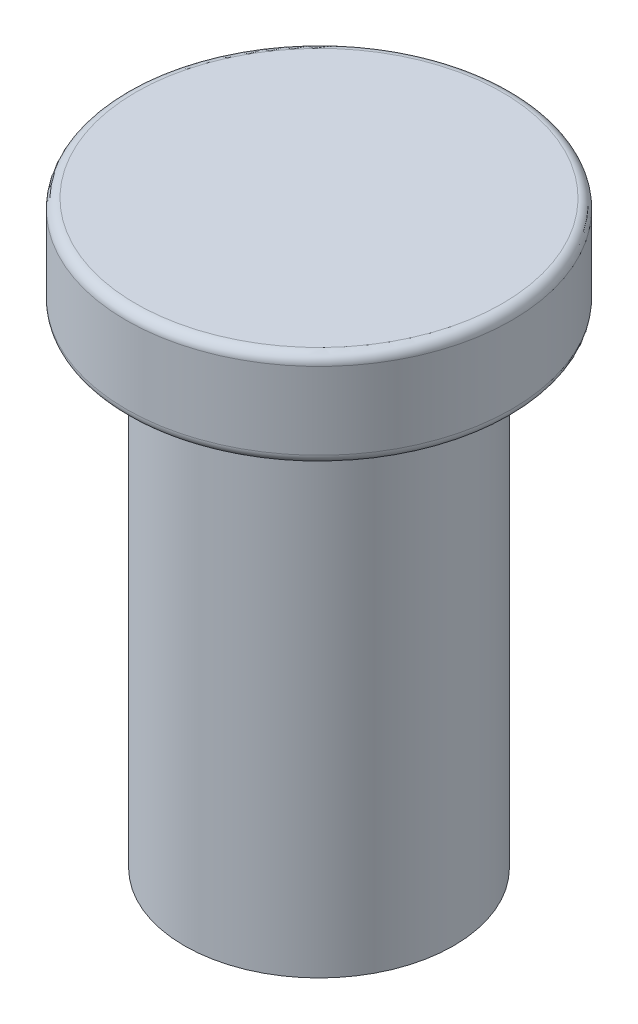
ISO-10303-21;
HEADER;
FILE_DESCRIPTION(('STEP AP214'),'2;1');
FILE_NAME('part.step','',(''),(''),'','','');
FILE_SCHEMA(('AUTOMOTIVE_DESIGN { 1 0 10303 214 1 1 1 1 }'));
ENDSEC;
DATA;
#1=APPLICATION_CONTEXT('core data for automotive mechanical design processes');
#2=APPLICATION_PROTOCOL_DEFINITION('international standard','automotive_design',2000,#1);
#3=PRODUCT_CONTEXT('',#1,'mechanical');
#4=PRODUCT('Part','Part','',(#3));
#5=PRODUCT_RELATED_PRODUCT_CATEGORY('part','',(#4));
#6=PRODUCT_DEFINITION_FORMATION('','',#4);
#7=PRODUCT_DEFINITION_CONTEXT('part definition',#1,'design');
#8=PRODUCT_DEFINITION('design','',#6,#7);
#9=PRODUCT_DEFINITION_SHAPE('','',#8);
#10=(LENGTH_UNIT() NAMED_UNIT(*) SI_UNIT(.MILLI.,.METRE.));
#11=(NAMED_UNIT(*) PLANE_ANGLE_UNIT() SI_UNIT($,.RADIAN.));
#12=(NAMED_UNIT(*) SI_UNIT($,.STERADIAN.) SOLID_ANGLE_UNIT());
#13=UNCERTAINTY_MEASURE_WITH_UNIT(LENGTH_MEASURE(1.E-05),#10,'distance_accuracy_value','');
#14=(GEOMETRIC_REPRESENTATION_CONTEXT(3) GLOBAL_UNCERTAINTY_ASSIGNED_CONTEXT((#13)) GLOBAL_UNIT_ASSIGNED_CONTEXT((#10,
#11,#12)) REPRESENTATION_CONTEXT('',''));
#15=CARTESIAN_POINT('',(0.,0.,0.));
#16=DIRECTION('',(0.,0.,1.));
#17=DIRECTION('',(1.,0.,0.));
#18=AXIS2_PLACEMENT_3D('',#15,#16,#17);
#19=CARTESIAN_POINT('',(-2.37,11.22,0.));
#20=DIRECTION('',(0.,1.,0.));
#21=DIRECTION('',(-1.,0.,0.));
#22=AXIS2_PLACEMENT_3D('',#19,#20,#21);
#23=PLANE('',#22);
#24=CARTESIAN_POINT('',(0.,11.22,0.));
#25=DIRECTION('',(0.,-1.,0.));
#26=DIRECTION('',(1.,0.,0.));
#27=AXIS2_PLACEMENT_3D('',#24,#25,#26);
#28=CIRCLE('',#27,2.37);
#29=CARTESIAN_POINT('',(2.37,11.22,0.));
#30=VERTEX_POINT('',#29);
#31=EDGE_CURVE('E10',#30,#30,#28,.T.);
#32=ORIENTED_EDGE('',*,*,#31,.T.);
#33=EDGE_LOOP('',(#32));
#34=FACE_BOUND('',#33,.T.);
#35=ADVANCED_FACE('F34',(#34),#23,.F.);
#36=CARTESIAN_POINT('',(0.,11.02,0.));
#37=DIRECTION('',(0.,-1.,0.));
#38=DIRECTION('',(1.,0.,0.));
#39=AXIS2_PLACEMENT_3D('',#36,#37,#38);
#40=TOROIDAL_SURFACE('',#39,2.37,0.2);
#41=ORIENTED_EDGE('',*,*,#31,.F.);
#42=EDGE_LOOP('',(#41));
#43=FACE_BOUND('',#42,.T.);
#44=CARTESIAN_POINT('',(0.,11.02,0.));
#45=DIRECTION('',(0.,-1.,0.));
#46=DIRECTION('',(1.,0.,0.));
#47=AXIS2_PLACEMENT_3D('',#44,#45,#46);
#48=CIRCLE('',#47,2.57);
#49=CARTESIAN_POINT('',(2.57,11.02,0.));
#50=VERTEX_POINT('',#49);
#51=EDGE_CURVE('E41',#50,#50,#48,.T.);
#52=ORIENTED_EDGE('',*,*,#51,.T.);
#53=EDGE_LOOP('',(#52));
#54=FACE_BOUND('',#53,.T.);
#55=ADVANCED_FACE('F93',(#43,#54),#40,.F.);
#56=CARTESIAN_POINT('',(0.,0.,0.));
#57=DIRECTION('',(0.,-1.,0.));
#58=DIRECTION('',(1.,0.,0.));
#59=AXIS2_PLACEMENT_3D('',#56,#57,#58);
#60=CYLINDRICAL_SURFACE('',#59,2.57);
#61=ORIENTED_EDGE('',*,*,#51,.F.);
#62=EDGE_LOOP('',(#61));
#63=FACE_BOUND('',#62,.T.);
#64=CARTESIAN_POINT('',(0.,0.,0.));
#65=DIRECTION('',(0.,-1.,0.));
#66=DIRECTION('',(1.,0.,0.));
#67=AXIS2_PLACEMENT_3D('',#64,#65,#66);
#68=CIRCLE('',#67,2.57);
#69=CARTESIAN_POINT('',(2.57,0.,0.));
#70=VERTEX_POINT('',#69);
#71=EDGE_CURVE('E47',#70,#70,#68,.T.);
#72=ORIENTED_EDGE('',*,*,#71,.T.);
#73=EDGE_LOOP('',(#72));
#74=FACE_BOUND('',#73,.T.);
#75=ADVANCED_FACE('F97',(#63,#74),#60,.F.);
#76=CARTESIAN_POINT('',(-2.79999999999999,0.,0.));
#77=DIRECTION('',(0.,1.,0.));
#78=DIRECTION('',(-1.,0.,0.));
#79=AXIS2_PLACEMENT_3D('',#76,#77,#78);
#80=PLANE('',#79);
#81=ORIENTED_EDGE('',*,*,#71,.F.);
#82=EDGE_LOOP('',(#81));
#83=FACE_BOUND('',#82,.T.);
#84=CARTESIAN_POINT('',(0.,0.,0.));
#85=DIRECTION('',(0.,-1.,0.));
#86=DIRECTION('',(1.,0.,0.));
#87=AXIS2_PLACEMENT_3D('',#84,#85,#86);
#88=CIRCLE('',#87,2.79999999999999);
#89=CARTESIAN_POINT('',(2.79999999999999,0.,0.));
#90=VERTEX_POINT('',#89);
#91=EDGE_CURVE('E53',#90,#90,#88,.T.);
#92=ORIENTED_EDGE('',*,*,#91,.T.);
#93=EDGE_LOOP('',(#92));
#94=FACE_BOUND('',#93,.T.);
#95=ADVANCED_FACE('F102',(#83,#94),#80,.F.);
#96=CARTESIAN_POINT('',(0.,0.,0.));
#97=DIRECTION('',(0.,-1.,0.));
#98=DIRECTION('',(1.,0.,0.));
#99=AXIS2_PLACEMENT_3D('',#96,#97,#98);
#100=CYLINDRICAL_SURFACE('',#99,2.8);
#101=ORIENTED_EDGE('',*,*,#91,.F.);
#102=EDGE_LOOP('',(#101));
#103=FACE_BOUND('',#102,.T.);
#104=CARTESIAN_POINT('',(0.,10.07,0.));
#105=DIRECTION('',(0.,-1.,0.));
#106=DIRECTION('',(1.,0.,0.));
#107=AXIS2_PLACEMENT_3D('',#104,#105,#106);
#108=CIRCLE('',#107,2.8);
#109=CARTESIAN_POINT('',(2.8,10.07,0.));
#110=VERTEX_POINT('',#109);
#111=EDGE_CURVE('E59',#110,#110,#108,.T.);
#112=ORIENTED_EDGE('',*,*,#111,.T.);
#113=EDGE_LOOP('',(#112));
#114=FACE_BOUND('',#113,.T.);
#115=ADVANCED_FACE('F108',(#103,#114),#100,.T.);
#116=CARTESIAN_POINT('',(-3.81,10.07,0.));
#117=DIRECTION('',(0.,1.,0.));
#118=DIRECTION('',(-1.,0.,0.));
#119=AXIS2_PLACEMENT_3D('',#116,#117,#118);
#120=PLANE('',#119);
#121=ORIENTED_EDGE('',*,*,#111,.F.);
#122=EDGE_LOOP('',(#121));
#123=FACE_BOUND('',#122,.T.);
#124=CARTESIAN_POINT('',(0.,10.07,0.));
#125=DIRECTION('',(0.,-1.,0.));
#126=DIRECTION('',(1.,0.,0.));
#127=AXIS2_PLACEMENT_3D('',#124,#125,#126);
#128=CIRCLE('',#127,3.81);
#129=CARTESIAN_POINT('',(3.81,10.07,0.));
#130=VERTEX_POINT('',#129);
#131=EDGE_CURVE('E63',#130,#130,#128,.T.);
#132=ORIENTED_EDGE('',*,*,#131,.T.);
#133=EDGE_LOOP('',(#132));
#134=FACE_BOUND('',#133,.T.);
#135=ADVANCED_FACE('F112',(#123,#134),#120,.F.);
#136=CARTESIAN_POINT('',(0.,10.27,0.));
#137=DIRECTION('',(0.,-1.,0.));
#138=DIRECTION('',(1.,0.,0.));
#139=AXIS2_PLACEMENT_3D('',#136,#137,#138);
#140=TOROIDAL_SURFACE('',#139,3.81,0.2);
#141=ORIENTED_EDGE('',*,*,#131,.F.);
#142=EDGE_LOOP('',(#141));
#143=FACE_BOUND('',#142,.T.);
#144=CARTESIAN_POINT('',(0.,10.27,0.));
#145=DIRECTION('',(0.,-1.,0.));
#146=DIRECTION('',(1.,0.,0.));
#147=AXIS2_PLACEMENT_3D('',#144,#145,#146);
#148=CIRCLE('',#147,4.01);
#149=CARTESIAN_POINT('',(4.01,10.27,0.));
#150=VERTEX_POINT('',#149);
#151=EDGE_CURVE('E67',#150,#150,#148,.T.);
#152=ORIENTED_EDGE('',*,*,#151,.T.);
#153=EDGE_LOOP('',(#152));
#154=FACE_BOUND('',#153,.T.);
#155=ADVANCED_FACE('F116',(#143,#154),#140,.T.);
#156=CARTESIAN_POINT('',(0.,0.,0.));
#157=DIRECTION('',(0.,-1.,0.));
#158=DIRECTION('',(1.,0.,0.));
#159=AXIS2_PLACEMENT_3D('',#156,#157,#158);
#160=CYLINDRICAL_SURFACE('',#159,4.01);
#161=ORIENTED_EDGE('',*,*,#151,.F.);
#162=EDGE_LOOP('',(#161));
#163=FACE_BOUND('',#162,.T.);
#164=CARTESIAN_POINT('',(0.,11.87,0.));
#165=DIRECTION('',(0.,-1.,0.));
#166=DIRECTION('',(1.,0.,0.));
#167=AXIS2_PLACEMENT_3D('',#164,#165,#166);
#168=CIRCLE('',#167,4.01);
#169=CARTESIAN_POINT('',(4.01,11.87,0.));
#170=VERTEX_POINT('',#169);
#171=EDGE_CURVE('E71',#170,#170,#168,.T.);
#172=ORIENTED_EDGE('',*,*,#171,.T.);
#173=EDGE_LOOP('',(#172));
#174=FACE_BOUND('',#173,.T.);
#175=ADVANCED_FACE('F89',(#163,#174),#160,.T.);
#176=CARTESIAN_POINT('',(0.,11.87,0.));
#177=DIRECTION('',(0.,-1.,0.));
#178=DIRECTION('',(1.,0.,0.));
#179=AXIS2_PLACEMENT_3D('',#176,#177,#178);
#180=TOROIDAL_SURFACE('',#179,3.81,0.2);
#181=ORIENTED_EDGE('',*,*,#171,.F.);
#182=EDGE_LOOP('',(#181));
#183=FACE_BOUND('',#182,.T.);
#184=CARTESIAN_POINT('',(0.,12.07,0.));
#185=DIRECTION('',(0.,-1.,0.));
#186=DIRECTION('',(1.,0.,0.));
#187=AXIS2_PLACEMENT_3D('',#184,#185,#186);
#188=CIRCLE('',#187,3.81);
#189=CARTESIAN_POINT('',(3.81,12.07,0.));
#190=VERTEX_POINT('',#189);
#191=EDGE_CURVE('E75',#190,#190,#188,.T.);
#192=ORIENTED_EDGE('',*,*,#191,.T.);
#193=EDGE_LOOP('',(#192));
#194=FACE_BOUND('',#193,.T.);
#195=ADVANCED_FACE('F81',(#183,#194),#180,.T.);
#196=CARTESIAN_POINT('',(0.,12.07,0.));
#197=DIRECTION('',(0.,-1.,0.));
#198=DIRECTION('',(1.,0.,0.));
#199=AXIS2_PLACEMENT_3D('',#196,#197,#198);
#200=PLANE('',#199);
#201=ORIENTED_EDGE('',*,*,#191,.F.);
#202=EDGE_LOOP('',(#201));
#203=FACE_BOUND('',#202,.T.);
#204=ADVANCED_FACE('F83',(#203),#200,.F.);
#205=CLOSED_SHELL('',(#35,#55,#75,#95,#115,#135,#155,#175,#195,#204));
#206=MANIFOLD_SOLID_BREP('B2',#205);
#207=ADVANCED_BREP_SHAPE_REPRESENTATION('',(#18,#206),#14);
#208=SHAPE_DEFINITION_REPRESENTATION(#9,#207);
ENDSEC;
END-ISO-10303-21;
